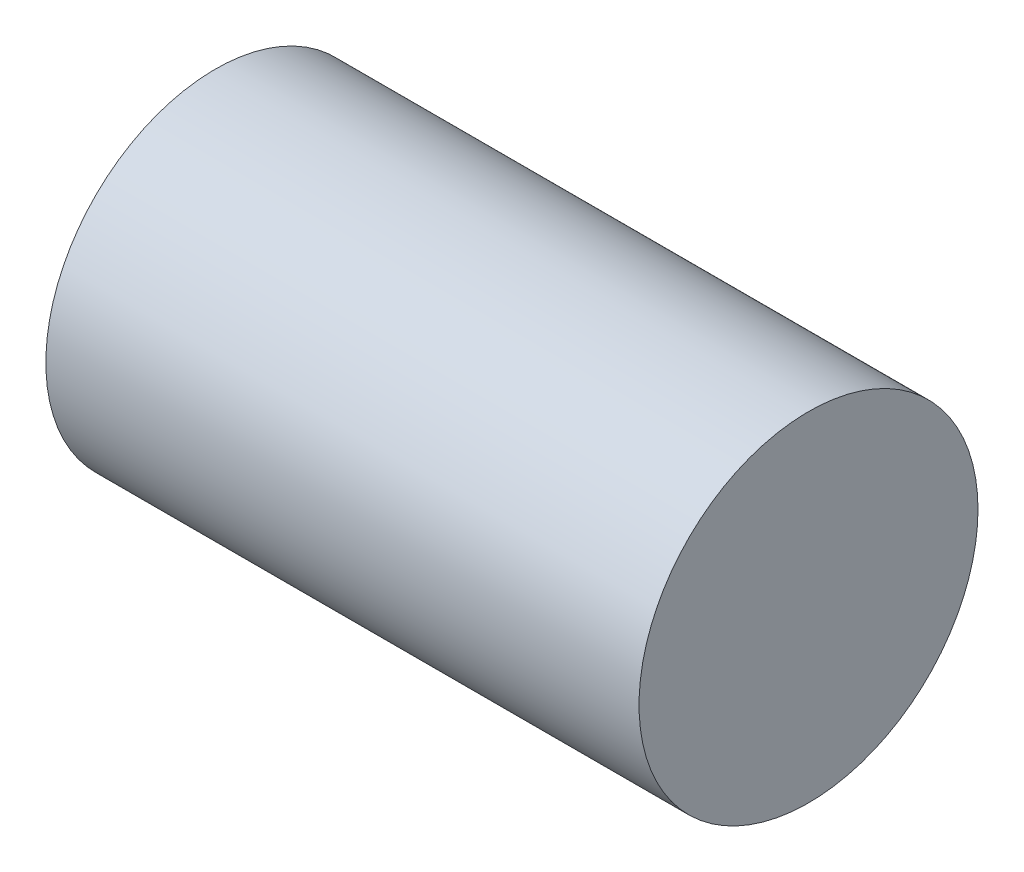
ISO-10303-21;
HEADER;
FILE_DESCRIPTION(('STEP AP214'),'2;1');
FILE_NAME('part.step','',(''),(''),'','','');
FILE_SCHEMA(('AUTOMOTIVE_DESIGN { 1 0 10303 214 1 1 1 1 }'));
ENDSEC;
DATA;
#1=APPLICATION_CONTEXT('core data for automotive mechanical design processes');
#2=APPLICATION_PROTOCOL_DEFINITION('international standard','automotive_design',2000,#1);
#3=PRODUCT_CONTEXT('',#1,'mechanical');
#4=PRODUCT('Part','Part','',(#3));
#5=PRODUCT_RELATED_PRODUCT_CATEGORY('part','',(#4));
#6=PRODUCT_DEFINITION_FORMATION('','',#4);
#7=PRODUCT_DEFINITION_CONTEXT('part definition',#1,'design');
#8=PRODUCT_DEFINITION('design','',#6,#7);
#9=PRODUCT_DEFINITION_SHAPE('','',#8);
#10=(LENGTH_UNIT() NAMED_UNIT(*) SI_UNIT(.MILLI.,.METRE.));
#11=(NAMED_UNIT(*) PLANE_ANGLE_UNIT() SI_UNIT($,.RADIAN.));
#12=(NAMED_UNIT(*) SI_UNIT($,.STERADIAN.) SOLID_ANGLE_UNIT());
#13=UNCERTAINTY_MEASURE_WITH_UNIT(LENGTH_MEASURE(1.E-05),#10,'distance_accuracy_value','');
#14=(GEOMETRIC_REPRESENTATION_CONTEXT(3) GLOBAL_UNCERTAINTY_ASSIGNED_CONTEXT((#13)) GLOBAL_UNIT_ASSIGNED_CONTEXT((#10,
#11,#12)) REPRESENTATION_CONTEXT('',''));
#15=CARTESIAN_POINT('',(0.,0.,0.));
#16=DIRECTION('',(0.,0.,1.));
#17=DIRECTION('',(1.,0.,0.));
#18=AXIS2_PLACEMENT_3D('',#15,#16,#17);
#19=CARTESIAN_POINT('',(700.,0.,0.));
#20=DIRECTION('',(-1.,0.,0.));
#21=DIRECTION('',(0.,0.,1.));
#22=AXIS2_PLACEMENT_3D('',#19,#20,#21);
#23=CYLINDRICAL_SURFACE('',#22,200.);
#24=CARTESIAN_POINT('',(700.,0.,0.));
#25=DIRECTION('',(1.,0.,0.));
#26=DIRECTION('',(0.,0.,-1.));
#27=AXIS2_PLACEMENT_3D('',#24,#25,#26);
#28=CIRCLE('',#27,200.);
#29=CARTESIAN_POINT('',(700.,0.,-200.));
#30=VERTEX_POINT('',#29);
#31=EDGE_CURVE('E10',#30,#30,#28,.T.);
#32=ORIENTED_EDGE('',*,*,#31,.F.);
#33=EDGE_LOOP('',(#32));
#34=FACE_BOUND('',#33,.T.);
#35=CARTESIAN_POINT('',(0.,0.,0.));
#36=DIRECTION('',(1.,0.,0.));
#37=DIRECTION('',(0.,0.,-1.));
#38=AXIS2_PLACEMENT_3D('',#35,#36,#37);
#39=CIRCLE('',#38,200.);
#40=CARTESIAN_POINT('',(0.,0.,-200.));
#41=VERTEX_POINT('',#40);
#42=EDGE_CURVE('E40',#41,#41,#39,.T.);
#43=ORIENTED_EDGE('',*,*,#42,.T.);
#44=EDGE_LOOP('',(#43));
#45=FACE_BOUND('',#44,.T.);
#46=ADVANCED_FACE('F37',(#34,#45),#23,.T.);
#47=CARTESIAN_POINT('',(700.,0.,0.));
#48=DIRECTION('',(1.,0.,0.));
#49=DIRECTION('',(0.,0.,-1.));
#50=AXIS2_PLACEMENT_3D('',#47,#48,#49);
#51=PLANE('',#50);
#52=ORIENTED_EDGE('',*,*,#31,.T.);
#53=EDGE_LOOP('',(#52));
#54=FACE_BOUND('',#53,.T.);
#55=ADVANCED_FACE('F54',(#54),#51,.T.);
#56=CARTESIAN_POINT('',(0.,0.,0.));
#57=DIRECTION('',(1.,0.,0.));
#58=DIRECTION('',(0.,0.,-1.));
#59=AXIS2_PLACEMENT_3D('',#56,#57,#58);
#60=PLANE('',#59);
#61=ORIENTED_EDGE('',*,*,#42,.F.);
#62=EDGE_LOOP('',(#61));
#63=FACE_BOUND('',#62,.T.);
#64=ADVANCED_FACE('F52',(#63),#60,.F.);
#65=CLOSED_SHELL('',(#46,#55,#64));
#66=MANIFOLD_SOLID_BREP('B2',#65);
#67=ADVANCED_BREP_SHAPE_REPRESENTATION('',(#18,#66),#14);
#68=SHAPE_DEFINITION_REPRESENTATION(#9,#67);
ENDSEC;
END-ISO-10303-21;
